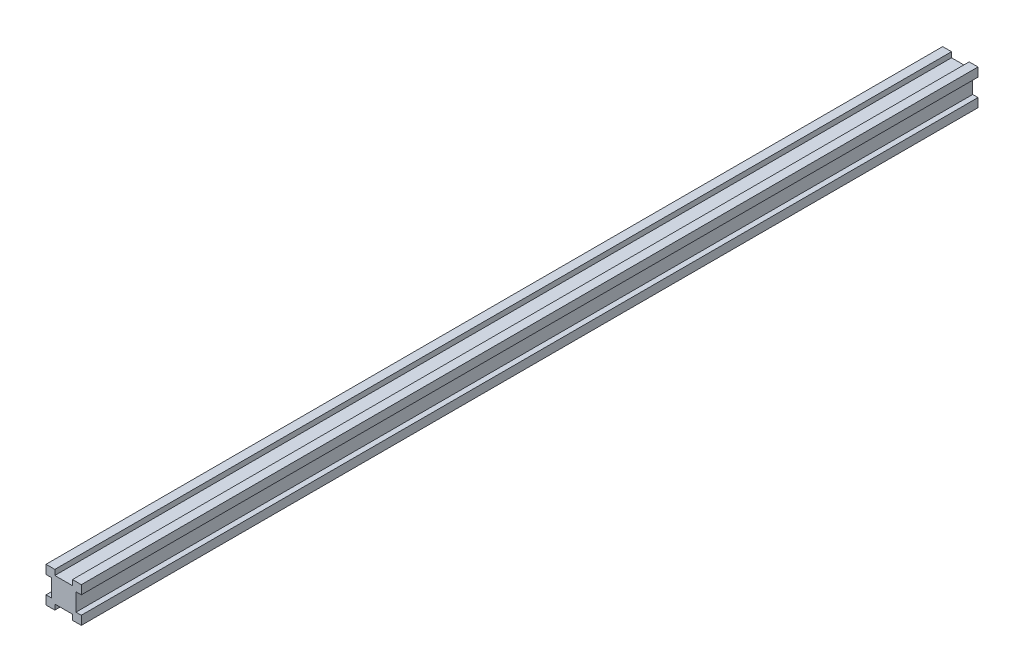
ISO-10303-21;
HEADER;
FILE_DESCRIPTION(('STEP AP214'),'2;1');
FILE_NAME('part.step','',(''),(''),'','','');
FILE_SCHEMA(('AUTOMOTIVE_DESIGN { 1 0 10303 214 1 1 1 1 }'));
ENDSEC;
DATA;
#1=APPLICATION_CONTEXT('core data for automotive mechanical design processes');
#2=APPLICATION_PROTOCOL_DEFINITION('international standard','automotive_design',2000,#1);
#3=PRODUCT_CONTEXT('',#1,'mechanical');
#4=PRODUCT('Part','Part','',(#3));
#5=PRODUCT_RELATED_PRODUCT_CATEGORY('part','',(#4));
#6=PRODUCT_DEFINITION_FORMATION('','',#4);
#7=PRODUCT_DEFINITION_CONTEXT('part definition',#1,'design');
#8=PRODUCT_DEFINITION('design','',#6,#7);
#9=PRODUCT_DEFINITION_SHAPE('','',#8);
#10=(LENGTH_UNIT() NAMED_UNIT(*) SI_UNIT(.MILLI.,.METRE.));
#11=(NAMED_UNIT(*) PLANE_ANGLE_UNIT() SI_UNIT($,.RADIAN.));
#12=(NAMED_UNIT(*) SI_UNIT($,.STERADIAN.) SOLID_ANGLE_UNIT());
#13=UNCERTAINTY_MEASURE_WITH_UNIT(LENGTH_MEASURE(1.E-05),#10,'distance_accuracy_value','');
#14=(GEOMETRIC_REPRESENTATION_CONTEXT(3) GLOBAL_UNCERTAINTY_ASSIGNED_CONTEXT((#13)) GLOBAL_UNIT_ASSIGNED_CONTEXT((#10,
#11,#12)) REPRESENTATION_CONTEXT('',''));
#15=CARTESIAN_POINT('',(0.,0.,0.));
#16=DIRECTION('',(0.,0.,1.));
#17=DIRECTION('',(1.,0.,0.));
#18=AXIS2_PLACEMENT_3D('',#15,#16,#17);
#19=CARTESIAN_POINT('',(-10.,0.,254.));
#20=DIRECTION('',(-1.,0.,0.));
#21=DIRECTION('',(0.,-1.,0.));
#22=AXIS2_PLACEMENT_3D('',#19,#20,#21);
#23=PLANE('',#22);
#24=DIRECTION('',(0.,1.,0.));
#25=VECTOR('',#24,1.);
#26=CARTESIAN_POINT('',(-10.,0.,-254.));
#27=LINE('',#26,#25);
#28=CARTESIAN_POINT('',(-10.,5.,-254.));
#29=VERTEX_POINT('',#28);
#30=CARTESIAN_POINT('',(-10.,10.,-254.));
#31=VERTEX_POINT('',#30);
#32=EDGE_CURVE('E202',#29,#31,#27,.T.);
#33=ORIENTED_EDGE('',*,*,#32,.F.);
#34=DIRECTION('',(0.,0.,-1.));
#35=VECTOR('',#34,1.);
#36=CARTESIAN_POINT('',(-10.,5.,254.));
#37=LINE('',#36,#35);
#38=CARTESIAN_POINT('',(-10.,5.,254.));
#39=VERTEX_POINT('',#38);
#40=EDGE_CURVE('E11',#39,#29,#37,.T.);
#41=ORIENTED_EDGE('',*,*,#40,.F.);
#42=DIRECTION('',(0.,1.,0.));
#43=VECTOR('',#42,1.);
#44=CARTESIAN_POINT('',(-10.,0.,254.));
#45=LINE('',#44,#43);
#46=CARTESIAN_POINT('',(-10.,10.,254.));
#47=VERTEX_POINT('',#46);
#48=EDGE_CURVE('E256',#39,#47,#45,.T.);
#49=ORIENTED_EDGE('',*,*,#48,.T.);
#50=DIRECTION('',(0.,0.,-1.));
#51=VECTOR('',#50,1.);
#52=CARTESIAN_POINT('',(-10.,10.,254.));
#53=LINE('',#52,#51);
#54=EDGE_CURVE('E53',#47,#31,#53,.T.);
#55=ORIENTED_EDGE('',*,*,#54,.T.);
#56=EDGE_LOOP('',(#33,#41,#49,#55));
#57=FACE_BOUND('',#56,.T.);
#58=ADVANCED_FACE('F37',(#57),#23,.T.);
#59=CARTESIAN_POINT('',(0.,5.,254.));
#60=DIRECTION('',(0.,-1.,0.));
#61=DIRECTION('',(1.,0.,0.));
#62=AXIS2_PLACEMENT_3D('',#59,#60,#61);
#63=PLANE('',#62);
#64=DIRECTION('',(-1.,0.,0.));
#65=VECTOR('',#64,1.);
#66=CARTESIAN_POINT('',(0.,5.,-254.));
#67=LINE('',#66,#65);
#68=CARTESIAN_POINT('',(-7.,5.,-254.));
#69=VERTEX_POINT('',#68);
#70=EDGE_CURVE('E204',#69,#29,#67,.T.);
#71=ORIENTED_EDGE('',*,*,#70,.F.);
#72=DIRECTION('',(0.,0.,-1.));
#73=VECTOR('',#72,1.);
#74=CARTESIAN_POINT('',(-7.,5.,254.));
#75=LINE('',#74,#73);
#76=CARTESIAN_POINT('',(-7.,5.,254.));
#77=VERTEX_POINT('',#76);
#78=EDGE_CURVE('E45',#77,#69,#75,.T.);
#79=ORIENTED_EDGE('',*,*,#78,.F.);
#80=DIRECTION('',(-1.,0.,0.));
#81=VECTOR('',#80,1.);
#82=CARTESIAN_POINT('',(0.,5.,254.));
#83=LINE('',#82,#81);
#84=EDGE_CURVE('E311',#77,#39,#83,.T.);
#85=ORIENTED_EDGE('',*,*,#84,.T.);
#86=ORIENTED_EDGE('',*,*,#40,.T.);
#87=EDGE_LOOP('',(#71,#79,#85,#86));
#88=FACE_BOUND('',#87,.T.);
#89=ADVANCED_FACE('F298',(#88),#63,.T.);
#90=CARTESIAN_POINT('',(-7.,0.,254.));
#91=DIRECTION('',(-1.,0.,0.));
#92=DIRECTION('',(0.,-1.,0.));
#93=AXIS2_PLACEMENT_3D('',#90,#91,#92);
#94=PLANE('',#93);
#95=DIRECTION('',(0.,1.,0.));
#96=VECTOR('',#95,1.);
#97=CARTESIAN_POINT('',(-7.,0.,-254.));
#98=LINE('',#97,#96);
#99=CARTESIAN_POINT('',(-7.,-5.,-254.));
#100=VERTEX_POINT('',#99);
#101=EDGE_CURVE('E207',#100,#69,#98,.T.);
#102=ORIENTED_EDGE('',*,*,#101,.F.);
#103=DIRECTION('',(0.,0.,-1.));
#104=VECTOR('',#103,1.);
#105=CARTESIAN_POINT('',(-7.,-5.,254.));
#106=LINE('',#105,#104);
#107=CARTESIAN_POINT('',(-7.,-5.,254.));
#108=VERTEX_POINT('',#107);
#109=EDGE_CURVE('E287',#108,#100,#106,.T.);
#110=ORIENTED_EDGE('',*,*,#109,.F.);
#111=DIRECTION('',(0.,1.,0.));
#112=VECTOR('',#111,1.);
#113=CARTESIAN_POINT('',(-7.,0.,254.));
#114=LINE('',#113,#112);
#115=EDGE_CURVE('E294',#108,#77,#114,.T.);
#116=ORIENTED_EDGE('',*,*,#115,.T.);
#117=ORIENTED_EDGE('',*,*,#78,.T.);
#118=EDGE_LOOP('',(#102,#110,#116,#117));
#119=FACE_BOUND('',#118,.T.);
#120=ADVANCED_FACE('F292',(#119),#94,.T.);
#121=CARTESIAN_POINT('',(0.,-5.,254.));
#122=DIRECTION('',(0.,1.,0.));
#123=DIRECTION('',(-1.,0.,0.));
#124=AXIS2_PLACEMENT_3D('',#121,#122,#123);
#125=PLANE('',#124);
#126=DIRECTION('',(1.,0.,0.));
#127=VECTOR('',#126,1.);
#128=CARTESIAN_POINT('',(0.,-5.,-254.));
#129=LINE('',#128,#127);
#130=CARTESIAN_POINT('',(-10.,-5.,-254.));
#131=VERTEX_POINT('',#130);
#132=EDGE_CURVE('E210',#131,#100,#129,.T.);
#133=ORIENTED_EDGE('',*,*,#132,.F.);
#134=DIRECTION('',(0.,0.,-1.));
#135=VECTOR('',#134,1.);
#136=CARTESIAN_POINT('',(-10.,-5.,254.));
#137=LINE('',#136,#135);
#138=CARTESIAN_POINT('',(-10.,-5.,254.));
#139=VERTEX_POINT('',#138);
#140=EDGE_CURVE('E285',#139,#131,#137,.T.);
#141=ORIENTED_EDGE('',*,*,#140,.F.);
#142=DIRECTION('',(1.,0.,0.));
#143=VECTOR('',#142,1.);
#144=CARTESIAN_POINT('',(0.,-5.,254.));
#145=LINE('',#144,#143);
#146=EDGE_CURVE('E308',#139,#108,#145,.T.);
#147=ORIENTED_EDGE('',*,*,#146,.T.);
#148=ORIENTED_EDGE('',*,*,#109,.T.);
#149=EDGE_LOOP('',(#133,#141,#147,#148));
#150=FACE_BOUND('',#149,.T.);
#151=ADVANCED_FACE('F305',(#150),#125,.T.);
#152=CARTESIAN_POINT('',(-9.99999999999999,0.,254.));
#153=DIRECTION('',(-1.,0.,0.));
#154=DIRECTION('',(0.,-1.,0.));
#155=AXIS2_PLACEMENT_3D('',#152,#153,#154);
#156=PLANE('',#155);
#157=DIRECTION('',(0.,1.,0.));
#158=VECTOR('',#157,1.);
#159=CARTESIAN_POINT('',(-9.99999999999999,0.,-254.));
#160=LINE('',#159,#158);
#161=CARTESIAN_POINT('',(-10.,-10.,-254.));
#162=VERTEX_POINT('',#161);
#163=EDGE_CURVE('E213',#162,#131,#160,.T.);
#164=ORIENTED_EDGE('',*,*,#163,.F.);
#165=DIRECTION('',(0.,0.,-1.));
#166=VECTOR('',#165,1.);
#167=CARTESIAN_POINT('',(-10.,-10.,254.));
#168=LINE('',#167,#166);
#169=CARTESIAN_POINT('',(-10.,-10.,254.));
#170=VERTEX_POINT('',#169);
#171=EDGE_CURVE('E283',#170,#162,#168,.T.);
#172=ORIENTED_EDGE('',*,*,#171,.F.);
#173=DIRECTION('',(0.,1.,0.));
#174=VECTOR('',#173,1.);
#175=CARTESIAN_POINT('',(-9.99999999999999,0.,254.));
#176=LINE('',#175,#174);
#177=EDGE_CURVE('E313',#170,#139,#176,.T.);
#178=ORIENTED_EDGE('',*,*,#177,.T.);
#179=ORIENTED_EDGE('',*,*,#140,.T.);
#180=EDGE_LOOP('',(#164,#172,#178,#179));
#181=FACE_BOUND('',#180,.T.);
#182=ADVANCED_FACE('F371',(#181),#156,.T.);
#183=CARTESIAN_POINT('',(0.,-10.,254.));
#184=DIRECTION('',(0.,1.,0.));
#185=DIRECTION('',(0.,0.,1.));
#186=AXIS2_PLACEMENT_3D('',#183,#184,#185);
#187=PLANE('',#186);
#188=DIRECTION('',(1.,0.,0.));
#189=VECTOR('',#188,1.);
#190=CARTESIAN_POINT('',(0.,-10.,-254.));
#191=LINE('',#190,#189);
#192=CARTESIAN_POINT('',(-5.,-10.,-254.));
#193=VERTEX_POINT('',#192);
#194=EDGE_CURVE('E216',#162,#193,#191,.T.);
#195=ORIENTED_EDGE('',*,*,#194,.T.);
#196=DIRECTION('',(0.,0.,-1.));
#197=VECTOR('',#196,1.);
#198=CARTESIAN_POINT('',(-5.,-10.,254.));
#199=LINE('',#198,#197);
#200=CARTESIAN_POINT('',(-5.,-10.,254.));
#201=VERTEX_POINT('',#200);
#202=EDGE_CURVE('E281',#201,#193,#199,.T.);
#203=ORIENTED_EDGE('',*,*,#202,.F.);
#204=DIRECTION('',(1.,0.,0.));
#205=VECTOR('',#204,1.);
#206=CARTESIAN_POINT('',(0.,-10.,254.));
#207=LINE('',#206,#205);
#208=EDGE_CURVE('E319',#170,#201,#207,.T.);
#209=ORIENTED_EDGE('',*,*,#208,.F.);
#210=ORIENTED_EDGE('',*,*,#171,.T.);
#211=EDGE_LOOP('',(#195,#203,#209,#210));
#212=FACE_BOUND('',#211,.T.);
#213=ADVANCED_FACE('F374',(#212),#187,.F.);
#214=CARTESIAN_POINT('',(-5.,0.,254.));
#215=DIRECTION('',(1.,0.,0.));
#216=DIRECTION('',(0.,0.,-1.));
#217=AXIS2_PLACEMENT_3D('',#214,#215,#216);
#218=PLANE('',#217);
#219=DIRECTION('',(0.,-1.,0.));
#220=VECTOR('',#219,1.);
#221=CARTESIAN_POINT('',(-5.,0.,-254.));
#222=LINE('',#221,#220);
#223=CARTESIAN_POINT('',(-5.,-7.,-254.));
#224=VERTEX_POINT('',#223);
#225=EDGE_CURVE('E219',#224,#193,#222,.T.);
#226=ORIENTED_EDGE('',*,*,#225,.F.);
#227=DIRECTION('',(0.,0.,-1.));
#228=VECTOR('',#227,1.);
#229=CARTESIAN_POINT('',(-5.,-7.,254.));
#230=LINE('',#229,#228);
#231=CARTESIAN_POINT('',(-5.,-7.,254.));
#232=VERTEX_POINT('',#231);
#233=EDGE_CURVE('E279',#232,#224,#230,.T.);
#234=ORIENTED_EDGE('',*,*,#233,.F.);
#235=DIRECTION('',(0.,-1.,0.));
#236=VECTOR('',#235,1.);
#237=CARTESIAN_POINT('',(-5.,0.,254.));
#238=LINE('',#237,#236);
#239=EDGE_CURVE('E321',#232,#201,#238,.T.);
#240=ORIENTED_EDGE('',*,*,#239,.T.);
#241=ORIENTED_EDGE('',*,*,#202,.T.);
#242=EDGE_LOOP('',(#226,#234,#240,#241));
#243=FACE_BOUND('',#242,.T.);
#244=ADVANCED_FACE('F376',(#243),#218,.T.);
#245=CARTESIAN_POINT('',(0.,-7.,254.));
#246=DIRECTION('',(0.,-1.,0.));
#247=DIRECTION('',(1.,0.,0.));
#248=AXIS2_PLACEMENT_3D('',#245,#246,#247);
#249=PLANE('',#248);
#250=DIRECTION('',(-1.,0.,0.));
#251=VECTOR('',#250,1.);
#252=CARTESIAN_POINT('',(0.,-7.,-254.));
#253=LINE('',#252,#251);
#254=CARTESIAN_POINT('',(5.,-7.,-254.));
#255=VERTEX_POINT('',#254);
#256=EDGE_CURVE('E223',#255,#224,#253,.T.);
#257=ORIENTED_EDGE('',*,*,#256,.F.);
#258=DIRECTION('',(0.,0.,-1.));
#259=VECTOR('',#258,1.);
#260=CARTESIAN_POINT('',(5.,-7.,254.));
#261=LINE('',#260,#259);
#262=CARTESIAN_POINT('',(5.,-7.,254.));
#263=VERTEX_POINT('',#262);
#264=EDGE_CURVE('E277',#263,#255,#261,.T.);
#265=ORIENTED_EDGE('',*,*,#264,.F.);
#266=DIRECTION('',(-1.,0.,0.));
#267=VECTOR('',#266,1.);
#268=CARTESIAN_POINT('',(0.,-7.,254.));
#269=LINE('',#268,#267);
#270=EDGE_CURVE('E325',#263,#232,#269,.T.);
#271=ORIENTED_EDGE('',*,*,#270,.T.);
#272=ORIENTED_EDGE('',*,*,#233,.T.);
#273=EDGE_LOOP('',(#257,#265,#271,#272));
#274=FACE_BOUND('',#273,.T.);
#275=ADVANCED_FACE('F379',(#274),#249,.T.);
#276=CARTESIAN_POINT('',(5.,0.,254.));
#277=DIRECTION('',(-1.,0.,0.));
#278=DIRECTION('',(0.,0.,1.));
#279=AXIS2_PLACEMENT_3D('',#276,#277,#278);
#280=PLANE('',#279);
#281=DIRECTION('',(0.,1.,0.));
#282=VECTOR('',#281,1.);
#283=CARTESIAN_POINT('',(5.,0.,-254.));
#284=LINE('',#283,#282);
#285=CARTESIAN_POINT('',(5.,-10.,-254.));
#286=VERTEX_POINT('',#285);
#287=EDGE_CURVE('E226',#286,#255,#284,.T.);
#288=ORIENTED_EDGE('',*,*,#287,.F.);
#289=DIRECTION('',(0.,0.,-1.));
#290=VECTOR('',#289,1.);
#291=CARTESIAN_POINT('',(5.,-10.,254.));
#292=LINE('',#291,#290);
#293=CARTESIAN_POINT('',(5.,-10.,254.));
#294=VERTEX_POINT('',#293);
#295=EDGE_CURVE('E275',#294,#286,#292,.T.);
#296=ORIENTED_EDGE('',*,*,#295,.F.);
#297=DIRECTION('',(0.,1.,0.));
#298=VECTOR('',#297,1.);
#299=CARTESIAN_POINT('',(5.,0.,254.));
#300=LINE('',#299,#298);
#301=EDGE_CURVE('E328',#294,#263,#300,.T.);
#302=ORIENTED_EDGE('',*,*,#301,.T.);
#303=ORIENTED_EDGE('',*,*,#264,.T.);
#304=EDGE_LOOP('',(#288,#296,#302,#303));
#305=FACE_BOUND('',#304,.T.);
#306=ADVANCED_FACE('F383',(#305),#280,.T.);
#307=CARTESIAN_POINT('',(10.,-10.,-254.));
#308=VERTEX_POINT('',#307);
#309=EDGE_CURVE('E220',#286,#308,#191,.T.);
#310=ORIENTED_EDGE('',*,*,#309,.T.);
#311=DIRECTION('',(0.,0.,-1.));
#312=VECTOR('',#311,1.);
#313=CARTESIAN_POINT('',(10.,-10.,254.));
#314=LINE('',#313,#312);
#315=CARTESIAN_POINT('',(10.,-10.,254.));
#316=VERTEX_POINT('',#315);
#317=EDGE_CURVE('E272',#316,#308,#314,.T.);
#318=ORIENTED_EDGE('',*,*,#317,.F.);
#319=EDGE_CURVE('E322',#294,#316,#207,.T.);
#320=ORIENTED_EDGE('',*,*,#319,.F.);
#321=ORIENTED_EDGE('',*,*,#295,.T.);
#322=EDGE_LOOP('',(#310,#318,#320,#321));
#323=FACE_BOUND('',#322,.T.);
#324=ADVANCED_FACE('F387',(#323),#187,.F.);
#325=CARTESIAN_POINT('',(10.,0.,254.));
#326=DIRECTION('',(-1.,0.,0.));
#327=DIRECTION('',(0.,0.,1.));
#328=AXIS2_PLACEMENT_3D('',#325,#326,#327);
#329=PLANE('',#328);
#330=DIRECTION('',(0.,1.,0.));
#331=VECTOR('',#330,1.);
#332=CARTESIAN_POINT('',(10.,0.,-254.));
#333=LINE('',#332,#331);
#334=CARTESIAN_POINT('',(10.,-5.,-254.));
#335=VERTEX_POINT('',#334);
#336=EDGE_CURVE('E229',#308,#335,#333,.T.);
#337=ORIENTED_EDGE('',*,*,#336,.T.);
#338=DIRECTION('',(0.,0.,-1.));
#339=VECTOR('',#338,1.);
#340=CARTESIAN_POINT('',(10.,-5.,254.));
#341=LINE('',#340,#339);
#342=CARTESIAN_POINT('',(10.,-5.,254.));
#343=VERTEX_POINT('',#342);
#344=EDGE_CURVE('E270',#343,#335,#341,.T.);
#345=ORIENTED_EDGE('',*,*,#344,.F.);
#346=DIRECTION('',(0.,1.,0.));
#347=VECTOR('',#346,1.);
#348=CARTESIAN_POINT('',(10.,0.,254.));
#349=LINE('',#348,#347);
#350=EDGE_CURVE('E331',#316,#343,#349,.T.);
#351=ORIENTED_EDGE('',*,*,#350,.F.);
#352=ORIENTED_EDGE('',*,*,#317,.T.);
#353=EDGE_LOOP('',(#337,#345,#351,#352));
#354=FACE_BOUND('',#353,.T.);
#355=ADVANCED_FACE('F391',(#354),#329,.F.);
#356=CARTESIAN_POINT('',(0.,-5.,254.));
#357=DIRECTION('',(0.,1.,0.));
#358=DIRECTION('',(-1.,0.,0.));
#359=AXIS2_PLACEMENT_3D('',#356,#357,#358);
#360=PLANE('',#359);
#361=DIRECTION('',(1.,0.,0.));
#362=VECTOR('',#361,1.);
#363=CARTESIAN_POINT('',(0.,-5.,-254.));
#364=LINE('',#363,#362);
#365=CARTESIAN_POINT('',(7.,-5.,-254.));
#366=VERTEX_POINT('',#365);
#367=EDGE_CURVE('E232',#366,#335,#364,.T.);
#368=ORIENTED_EDGE('',*,*,#367,.F.);
#369=DIRECTION('',(0.,0.,-1.));
#370=VECTOR('',#369,1.);
#371=CARTESIAN_POINT('',(7.,-5.,254.));
#372=LINE('',#371,#370);
#373=CARTESIAN_POINT('',(7.,-5.,254.));
#374=VERTEX_POINT('',#373);
#375=EDGE_CURVE('E268',#374,#366,#372,.T.);
#376=ORIENTED_EDGE('',*,*,#375,.F.);
#377=DIRECTION('',(1.,0.,0.));
#378=VECTOR('',#377,1.);
#379=CARTESIAN_POINT('',(0.,-5.,254.));
#380=LINE('',#379,#378);
#381=EDGE_CURVE('E333',#374,#343,#380,.T.);
#382=ORIENTED_EDGE('',*,*,#381,.T.);
#383=ORIENTED_EDGE('',*,*,#344,.T.);
#384=EDGE_LOOP('',(#368,#376,#382,#383));
#385=FACE_BOUND('',#384,.T.);
#386=ADVANCED_FACE('F395',(#385),#360,.T.);
#387=CARTESIAN_POINT('',(7.,0.,254.));
#388=DIRECTION('',(1.,0.,0.));
#389=DIRECTION('',(0.,0.,-1.));
#390=AXIS2_PLACEMENT_3D('',#387,#388,#389);
#391=PLANE('',#390);
#392=DIRECTION('',(0.,-1.,0.));
#393=VECTOR('',#392,1.);
#394=CARTESIAN_POINT('',(7.,0.,-254.));
#395=LINE('',#394,#393);
#396=CARTESIAN_POINT('',(7.,5.,-254.));
#397=VERTEX_POINT('',#396);
#398=EDGE_CURVE('E235',#397,#366,#395,.T.);
#399=ORIENTED_EDGE('',*,*,#398,.F.);
#400=DIRECTION('',(0.,0.,-1.));
#401=VECTOR('',#400,1.);
#402=CARTESIAN_POINT('',(7.,5.,254.));
#403=LINE('',#402,#401);
#404=CARTESIAN_POINT('',(7.,5.,254.));
#405=VERTEX_POINT('',#404);
#406=EDGE_CURVE('E266',#405,#397,#403,.T.);
#407=ORIENTED_EDGE('',*,*,#406,.F.);
#408=DIRECTION('',(0.,-1.,0.));
#409=VECTOR('',#408,1.);
#410=CARTESIAN_POINT('',(7.,0.,254.));
#411=LINE('',#410,#409);
#412=EDGE_CURVE('E336',#405,#374,#411,.T.);
#413=ORIENTED_EDGE('',*,*,#412,.T.);
#414=ORIENTED_EDGE('',*,*,#375,.T.);
#415=EDGE_LOOP('',(#399,#407,#413,#414));
#416=FACE_BOUND('',#415,.T.);
#417=ADVANCED_FACE('F399',(#416),#391,.T.);
#418=CARTESIAN_POINT('',(0.,5.,254.));
#419=DIRECTION('',(0.,-1.,0.));
#420=DIRECTION('',(1.,0.,0.));
#421=AXIS2_PLACEMENT_3D('',#418,#419,#420);
#422=PLANE('',#421);
#423=DIRECTION('',(-1.,0.,0.));
#424=VECTOR('',#423,1.);
#425=CARTESIAN_POINT('',(0.,5.,-254.));
#426=LINE('',#425,#424);
#427=CARTESIAN_POINT('',(10.,5.,-254.));
#428=VERTEX_POINT('',#427);
#429=EDGE_CURVE('E238',#428,#397,#426,.T.);
#430=ORIENTED_EDGE('',*,*,#429,.F.);
#431=DIRECTION('',(0.,0.,-1.));
#432=VECTOR('',#431,1.);
#433=CARTESIAN_POINT('',(10.,5.,254.));
#434=LINE('',#433,#432);
#435=CARTESIAN_POINT('',(10.,5.,254.));
#436=VERTEX_POINT('',#435);
#437=EDGE_CURVE('E264',#436,#428,#434,.T.);
#438=ORIENTED_EDGE('',*,*,#437,.F.);
#439=DIRECTION('',(-1.,0.,0.));
#440=VECTOR('',#439,1.);
#441=CARTESIAN_POINT('',(0.,5.,254.));
#442=LINE('',#441,#440);
#443=EDGE_CURVE('E339',#436,#405,#442,.T.);
#444=ORIENTED_EDGE('',*,*,#443,.T.);
#445=ORIENTED_EDGE('',*,*,#406,.T.);
#446=EDGE_LOOP('',(#430,#438,#444,#445));
#447=FACE_BOUND('',#446,.T.);
#448=ADVANCED_FACE('F403',(#447),#422,.T.);
#449=CARTESIAN_POINT('',(10.,0.,254.));
#450=DIRECTION('',(-1.,0.,0.));
#451=DIRECTION('',(0.,0.,1.));
#452=AXIS2_PLACEMENT_3D('',#449,#450,#451);
#453=PLANE('',#452);
#454=DIRECTION('',(0.,1.,0.));
#455=VECTOR('',#454,1.);
#456=CARTESIAN_POINT('',(10.,0.,-254.));
#457=LINE('',#456,#455);
#458=CARTESIAN_POINT('',(10.,10.,-254.));
#459=VERTEX_POINT('',#458);
#460=EDGE_CURVE('E241',#428,#459,#457,.T.);
#461=ORIENTED_EDGE('',*,*,#460,.T.);
#462=DIRECTION('',(0.,0.,-1.));
#463=VECTOR('',#462,1.);
#464=CARTESIAN_POINT('',(10.,10.,254.));
#465=LINE('',#464,#463);
#466=CARTESIAN_POINT('',(10.,10.,254.));
#467=VERTEX_POINT('',#466);
#468=EDGE_CURVE('E262',#467,#459,#465,.T.);
#469=ORIENTED_EDGE('',*,*,#468,.F.);
#470=DIRECTION('',(0.,1.,0.));
#471=VECTOR('',#470,1.);
#472=CARTESIAN_POINT('',(10.,0.,254.));
#473=LINE('',#472,#471);
#474=EDGE_CURVE('E342',#436,#467,#473,.T.);
#475=ORIENTED_EDGE('',*,*,#474,.F.);
#476=ORIENTED_EDGE('',*,*,#437,.T.);
#477=EDGE_LOOP('',(#461,#469,#475,#476));
#478=FACE_BOUND('',#477,.T.);
#479=ADVANCED_FACE('F407',(#478),#453,.F.);
#480=CARTESIAN_POINT('',(0.,10.,254.));
#481=DIRECTION('',(0.,1.,0.));
#482=DIRECTION('',(0.,0.,1.));
#483=AXIS2_PLACEMENT_3D('',#480,#481,#482);
#484=PLANE('',#483);
#485=DIRECTION('',(1.,0.,0.));
#486=VECTOR('',#485,1.);
#487=CARTESIAN_POINT('',(0.,10.,-254.));
#488=LINE('',#487,#486);
#489=CARTESIAN_POINT('',(5.,10.,-254.));
#490=VERTEX_POINT('',#489);
#491=EDGE_CURVE('E244',#490,#459,#488,.T.);
#492=ORIENTED_EDGE('',*,*,#491,.F.);
#493=DIRECTION('',(0.,0.,-1.));
#494=VECTOR('',#493,1.);
#495=CARTESIAN_POINT('',(5.,10.,254.));
#496=LINE('',#495,#494);
#497=CARTESIAN_POINT('',(5.,10.,254.));
#498=VERTEX_POINT('',#497);
#499=EDGE_CURVE('E260',#498,#490,#496,.T.);
#500=ORIENTED_EDGE('',*,*,#499,.F.);
#501=DIRECTION('',(1.,0.,0.));
#502=VECTOR('',#501,1.);
#503=CARTESIAN_POINT('',(0.,10.,254.));
#504=LINE('',#503,#502);
#505=EDGE_CURVE('E344',#498,#467,#504,.T.);
#506=ORIENTED_EDGE('',*,*,#505,.T.);
#507=ORIENTED_EDGE('',*,*,#468,.T.);
#508=EDGE_LOOP('',(#492,#500,#506,#507));
#509=FACE_BOUND('',#508,.T.);
#510=ADVANCED_FACE('F411',(#509),#484,.T.);
#511=CARTESIAN_POINT('',(5.,0.,254.));
#512=DIRECTION('',(-1.,0.,0.));
#513=DIRECTION('',(0.,-1.,0.));
#514=AXIS2_PLACEMENT_3D('',#511,#512,#513);
#515=PLANE('',#514);
#516=DIRECTION('',(0.,1.,0.));
#517=VECTOR('',#516,1.);
#518=CARTESIAN_POINT('',(5.,0.,-254.));
#519=LINE('',#518,#517);
#520=CARTESIAN_POINT('',(5.,7.,-254.));
#521=VERTEX_POINT('',#520);
#522=EDGE_CURVE('E247',#521,#490,#519,.T.);
#523=ORIENTED_EDGE('',*,*,#522,.F.);
#524=DIRECTION('',(0.,0.,-1.));
#525=VECTOR('',#524,1.);
#526=CARTESIAN_POINT('',(5.,7.,254.));
#527=LINE('',#526,#525);
#528=CARTESIAN_POINT('',(5.,7.,254.));
#529=VERTEX_POINT('',#528);
#530=EDGE_CURVE('E184',#529,#521,#527,.T.);
#531=ORIENTED_EDGE('',*,*,#530,.F.);
#532=DIRECTION('',(0.,1.,0.));
#533=VECTOR('',#532,1.);
#534=CARTESIAN_POINT('',(5.,0.,254.));
#535=LINE('',#534,#533);
#536=EDGE_CURVE('E194',#529,#498,#535,.T.);
#537=ORIENTED_EDGE('',*,*,#536,.T.);
#538=ORIENTED_EDGE('',*,*,#499,.T.);
#539=EDGE_LOOP('',(#523,#531,#537,#538));
#540=FACE_BOUND('',#539,.T.);
#541=ADVANCED_FACE('F348',(#540),#515,.T.);
#542=CARTESIAN_POINT('',(0.,7.,254.));
#543=DIRECTION('',(0.,1.,0.));
#544=DIRECTION('',(0.,0.,1.));
#545=AXIS2_PLACEMENT_3D('',#542,#543,#544);
#546=PLANE('',#545);
#547=DIRECTION('',(1.,0.,0.));
#548=VECTOR('',#547,1.);
#549=CARTESIAN_POINT('',(0.,7.,-254.));
#550=LINE('',#549,#548);
#551=CARTESIAN_POINT('',(-5.,7.,-254.));
#552=VERTEX_POINT('',#551);
#553=EDGE_CURVE('E180',#552,#521,#550,.T.);
#554=ORIENTED_EDGE('',*,*,#553,.F.);
#555=DIRECTION('',(0.,0.,-1.));
#556=VECTOR('',#555,1.);
#557=CARTESIAN_POINT('',(-5.,7.,254.));
#558=LINE('',#557,#556);
#559=CARTESIAN_POINT('',(-5.,7.,254.));
#560=VERTEX_POINT('',#559);
#561=EDGE_CURVE('E175',#560,#552,#558,.T.);
#562=ORIENTED_EDGE('',*,*,#561,.F.);
#563=DIRECTION('',(1.,0.,0.));
#564=VECTOR('',#563,1.);
#565=CARTESIAN_POINT('',(0.,7.,254.));
#566=LINE('',#565,#564);
#567=EDGE_CURVE('E178',#560,#529,#566,.T.);
#568=ORIENTED_EDGE('',*,*,#567,.T.);
#569=ORIENTED_EDGE('',*,*,#530,.T.);
#570=EDGE_LOOP('',(#554,#562,#568,#569));
#571=FACE_BOUND('',#570,.T.);
#572=ADVANCED_FACE('F177',(#571),#546,.T.);
#573=CARTESIAN_POINT('',(-5.,0.,254.));
#574=DIRECTION('',(1.,0.,0.));
#575=DIRECTION('',(0.,1.,0.));
#576=AXIS2_PLACEMENT_3D('',#573,#574,#575);
#577=PLANE('',#576);
#578=DIRECTION('',(0.,-1.,0.));
#579=VECTOR('',#578,1.);
#580=CARTESIAN_POINT('',(-5.,0.,-254.));
#581=LINE('',#580,#579);
#582=CARTESIAN_POINT('',(-5.,10.,-254.));
#583=VERTEX_POINT('',#582);
#584=EDGE_CURVE('E251',#583,#552,#581,.T.);
#585=ORIENTED_EDGE('',*,*,#584,.F.);
#586=DIRECTION('',(0.,0.,-1.));
#587=VECTOR('',#586,1.);
#588=CARTESIAN_POINT('',(-5.,10.,254.));
#589=LINE('',#588,#587);
#590=CARTESIAN_POINT('',(-5.,10.,254.));
#591=VERTEX_POINT('',#590);
#592=EDGE_CURVE('E114',#591,#583,#589,.T.);
#593=ORIENTED_EDGE('',*,*,#592,.F.);
#594=DIRECTION('',(0.,-1.,0.));
#595=VECTOR('',#594,1.);
#596=CARTESIAN_POINT('',(-5.,0.,254.));
#597=LINE('',#596,#595);
#598=EDGE_CURVE('E191',#591,#560,#597,.T.);
#599=ORIENTED_EDGE('',*,*,#598,.T.);
#600=ORIENTED_EDGE('',*,*,#561,.T.);
#601=EDGE_LOOP('',(#585,#593,#599,#600));
#602=FACE_BOUND('',#601,.T.);
#603=ADVANCED_FACE('F196',(#602),#577,.T.);
#604=CARTESIAN_POINT('',(0.,10.,254.));
#605=DIRECTION('',(0.,1.,0.));
#606=DIRECTION('',(0.,0.,1.));
#607=AXIS2_PLACEMENT_3D('',#604,#605,#606);
#608=PLANE('',#607);
#609=DIRECTION('',(1.,0.,0.));
#610=VECTOR('',#609,1.);
#611=CARTESIAN_POINT('',(0.,10.,-254.));
#612=LINE('',#611,#610);
#613=EDGE_CURVE('E253',#31,#583,#612,.T.);
#614=ORIENTED_EDGE('',*,*,#613,.F.);
#615=ORIENTED_EDGE('',*,*,#54,.F.);
#616=DIRECTION('',(1.,0.,0.));
#617=VECTOR('',#616,1.);
#618=CARTESIAN_POINT('',(0.,10.,254.));
#619=LINE('',#618,#617);
#620=EDGE_CURVE('E197',#47,#591,#619,.T.);
#621=ORIENTED_EDGE('',*,*,#620,.T.);
#622=ORIENTED_EDGE('',*,*,#592,.T.);
#623=EDGE_LOOP('',(#614,#615,#621,#622));
#624=FACE_BOUND('',#623,.T.);
#625=ADVANCED_FACE('F350',(#624),#608,.T.);
#626=CARTESIAN_POINT('',(0.,0.,254.));
#627=DIRECTION('',(0.,0.,1.));
#628=DIRECTION('',(1.,0.,0.));
#629=AXIS2_PLACEMENT_3D('',#626,#627,#628);
#630=PLANE('',#629);
#631=ORIENTED_EDGE('',*,*,#48,.F.);
#632=ORIENTED_EDGE('',*,*,#84,.F.);
#633=ORIENTED_EDGE('',*,*,#115,.F.);
#634=ORIENTED_EDGE('',*,*,#146,.F.);
#635=ORIENTED_EDGE('',*,*,#177,.F.);
#636=ORIENTED_EDGE('',*,*,#208,.T.);
#637=ORIENTED_EDGE('',*,*,#239,.F.);
#638=ORIENTED_EDGE('',*,*,#270,.F.);
#639=ORIENTED_EDGE('',*,*,#301,.F.);
#640=ORIENTED_EDGE('',*,*,#319,.T.);
#641=ORIENTED_EDGE('',*,*,#350,.T.);
#642=ORIENTED_EDGE('',*,*,#381,.F.);
#643=ORIENTED_EDGE('',*,*,#412,.F.);
#644=ORIENTED_EDGE('',*,*,#443,.F.);
#645=ORIENTED_EDGE('',*,*,#474,.T.);
#646=ORIENTED_EDGE('',*,*,#505,.F.);
#647=ORIENTED_EDGE('',*,*,#536,.F.);
#648=ORIENTED_EDGE('',*,*,#567,.F.);
#649=ORIENTED_EDGE('',*,*,#598,.F.);
#650=ORIENTED_EDGE('',*,*,#620,.F.);
#651=EDGE_LOOP('',(#631,#632,#633,#634,#635,#636,#637,#638,#639,#640,#641,#642,#643,#644,#645,
#646,#647,#648,#649,#650));
#652=FACE_BOUND('',#651,.T.);
#653=ADVANCED_FACE('F189',(#652),#630,.T.);
#654=CARTESIAN_POINT('',(0.,0.,-254.));
#655=DIRECTION('',(0.,0.,1.));
#656=DIRECTION('',(1.,0.,0.));
#657=AXIS2_PLACEMENT_3D('',#654,#655,#656);
#658=PLANE('',#657);
#659=ORIENTED_EDGE('',*,*,#32,.T.);
#660=ORIENTED_EDGE('',*,*,#613,.T.);
#661=ORIENTED_EDGE('',*,*,#584,.T.);
#662=ORIENTED_EDGE('',*,*,#553,.T.);
#663=ORIENTED_EDGE('',*,*,#522,.T.);
#664=ORIENTED_EDGE('',*,*,#491,.T.);
#665=ORIENTED_EDGE('',*,*,#460,.F.);
#666=ORIENTED_EDGE('',*,*,#429,.T.);
#667=ORIENTED_EDGE('',*,*,#398,.T.);
#668=ORIENTED_EDGE('',*,*,#367,.T.);
#669=ORIENTED_EDGE('',*,*,#336,.F.);
#670=ORIENTED_EDGE('',*,*,#309,.F.);
#671=ORIENTED_EDGE('',*,*,#287,.T.);
#672=ORIENTED_EDGE('',*,*,#256,.T.);
#673=ORIENTED_EDGE('',*,*,#225,.T.);
#674=ORIENTED_EDGE('',*,*,#194,.F.);
#675=ORIENTED_EDGE('',*,*,#163,.T.);
#676=ORIENTED_EDGE('',*,*,#132,.T.);
#677=ORIENTED_EDGE('',*,*,#101,.T.);
#678=ORIENTED_EDGE('',*,*,#70,.T.);
#679=EDGE_LOOP('',(#659,#660,#661,#662,#663,#664,#665,#666,#667,#668,#669,#670,#671,#672,#673,
#674,#675,#676,#677,#678));
#680=FACE_BOUND('',#679,.T.);
#681=ADVANCED_FACE('F300',(#680),#658,.F.);
#682=CLOSED_SHELL('',(#58,#89,#120,#151,#182,#213,#244,#275,#306,#324,#355,#386,#417,#448,#479,
#510,#541,#572,#603,#625,#653,#681));
#683=MANIFOLD_SOLID_BREP('B2',#682);
#684=ADVANCED_BREP_SHAPE_REPRESENTATION('',(#18,#683),#14);
#685=SHAPE_DEFINITION_REPRESENTATION(#9,#684);
ENDSEC;
END-ISO-10303-21;
